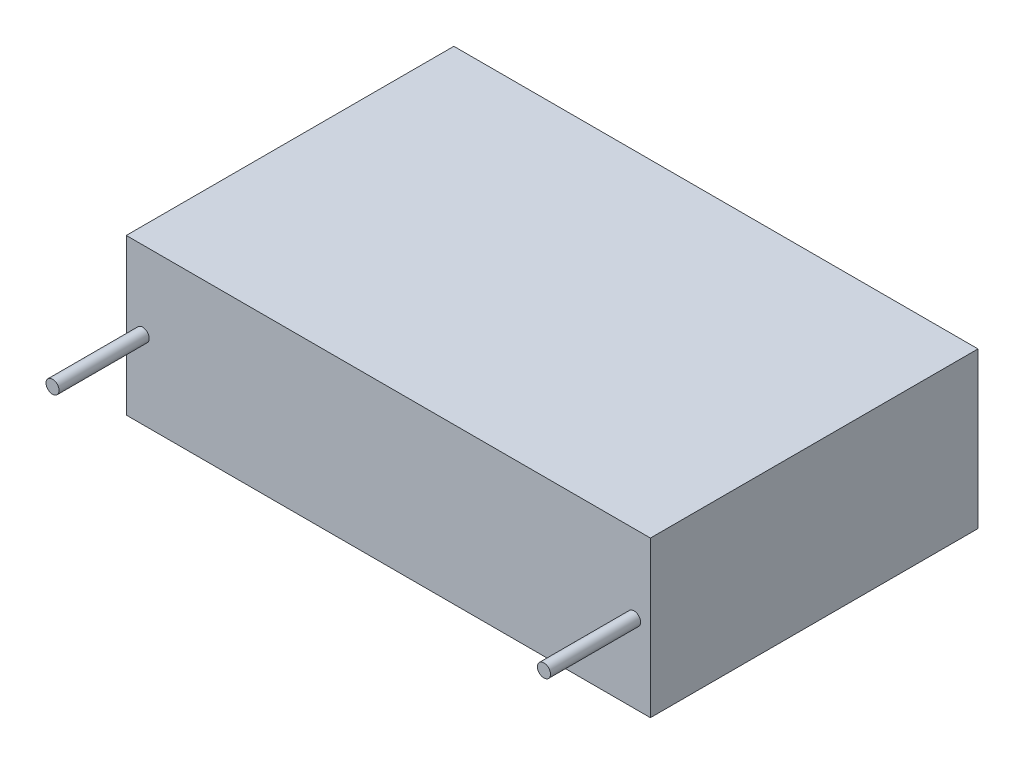
ISO-10303-21;
HEADER;
FILE_DESCRIPTION(('STEP AP214'),'2;1');
FILE_NAME('part.step','',(''),(''),'','','');
FILE_SCHEMA(('AUTOMOTIVE_DESIGN { 1 0 10303 214 1 1 1 1 }'));
ENDSEC;
DATA;
#1=APPLICATION_CONTEXT('core data for automotive mechanical design processes');
#2=APPLICATION_PROTOCOL_DEFINITION('international standard','automotive_design',2000,#1);
#3=PRODUCT_CONTEXT('',#1,'mechanical');
#4=PRODUCT('Part','Part','',(#3));
#5=PRODUCT_RELATED_PRODUCT_CATEGORY('part','',(#4));
#6=PRODUCT_DEFINITION_FORMATION('','',#4);
#7=PRODUCT_DEFINITION_CONTEXT('part definition',#1,'design');
#8=PRODUCT_DEFINITION('design','',#6,#7);
#9=PRODUCT_DEFINITION_SHAPE('','',#8);
#10=(LENGTH_UNIT() NAMED_UNIT(*) SI_UNIT(.MILLI.,.METRE.));
#11=(NAMED_UNIT(*) PLANE_ANGLE_UNIT() SI_UNIT($,.RADIAN.));
#12=(NAMED_UNIT(*) SI_UNIT($,.STERADIAN.) SOLID_ANGLE_UNIT());
#13=UNCERTAINTY_MEASURE_WITH_UNIT(LENGTH_MEASURE(1.E-05),#10,'distance_accuracy_value','');
#14=(GEOMETRIC_REPRESENTATION_CONTEXT(3) GLOBAL_UNCERTAINTY_ASSIGNED_CONTEXT((#13)) GLOBAL_UNIT_ASSIGNED_CONTEXT((#10,
#11,#12)) REPRESENTATION_CONTEXT('',''));
#15=CARTESIAN_POINT('',(0.,0.,0.));
#16=DIRECTION('',(0.,0.,1.));
#17=DIRECTION('',(1.,0.,0.));
#18=AXIS2_PLACEMENT_3D('',#15,#16,#17);
#19=CARTESIAN_POINT('',(0.,9.5,20.));
#20=DIRECTION('',(0.,0.,-1.));
#21=DIRECTION('',(-1.,0.,0.));
#22=AXIS2_PLACEMENT_3D('',#19,#20,#21);
#23=PLANE('',#22);
#24=CARTESIAN_POINT('',(1.,4.75,20.));
#25=DIRECTION('',(0.,0.,-1.));
#26=DIRECTION('',(-1.,0.,0.));
#27=AXIS2_PLACEMENT_3D('',#24,#25,#26);
#28=CIRCLE('',#27,0.4);
#29=CARTESIAN_POINT('',(0.600000000000001,4.75,20.));
#30=VERTEX_POINT('',#29);
#31=EDGE_CURVE('E40',#30,#30,#28,.F.);
#32=ORIENTED_EDGE('',*,*,#31,.F.);
#33=EDGE_LOOP('',(#32));
#34=FACE_BOUND('',#33,.T.);
#35=DIRECTION('',(0.,-1.,0.));
#36=VECTOR('',#35,1.);
#37=CARTESIAN_POINT('',(0.,0.,20.));
#38=LINE('',#37,#36);
#39=CARTESIAN_POINT('',(0.,9.5,20.));
#40=VERTEX_POINT('',#39);
#41=CARTESIAN_POINT('',(0.,0.,20.));
#42=VERTEX_POINT('',#41);
#43=EDGE_CURVE('E84',#40,#42,#38,.T.);
#44=ORIENTED_EDGE('',*,*,#43,.T.);
#45=DIRECTION('',(1.,0.,0.));
#46=VECTOR('',#45,1.);
#47=CARTESIAN_POINT('',(0.,0.,20.));
#48=LINE('',#47,#46);
#49=CARTESIAN_POINT('',(32.,0.,20.));
#50=VERTEX_POINT('',#49);
#51=EDGE_CURVE('E79',#42,#50,#48,.T.);
#52=ORIENTED_EDGE('',*,*,#51,.T.);
#53=DIRECTION('',(0.,1.,0.));
#54=VECTOR('',#53,1.);
#55=CARTESIAN_POINT('',(32.,0.,20.));
#56=LINE('',#55,#54);
#57=CARTESIAN_POINT('',(32.,9.5,20.));
#58=VERTEX_POINT('',#57);
#59=EDGE_CURVE('E82',#50,#58,#56,.T.);
#60=ORIENTED_EDGE('',*,*,#59,.T.);
#61=DIRECTION('',(-1.,0.,0.));
#62=VECTOR('',#61,1.);
#63=CARTESIAN_POINT('',(0.,9.5,20.));
#64=LINE('',#63,#62);
#65=EDGE_CURVE('E48',#58,#40,#64,.T.);
#66=ORIENTED_EDGE('',*,*,#65,.T.);
#67=EDGE_LOOP('',(#44,#52,#60,#66));
#68=FACE_BOUND('',#67,.T.);
#69=CARTESIAN_POINT('',(31.,4.75,20.));
#70=DIRECTION('',(0.,0.,-1.));
#71=DIRECTION('',(-1.,0.,0.));
#72=AXIS2_PLACEMENT_3D('',#69,#70,#71);
#73=CIRCLE('',#72,0.400000000000005);
#74=CARTESIAN_POINT('',(30.6,4.75,20.));
#75=VERTEX_POINT('',#74);
#76=EDGE_CURVE('E11',#75,#75,#73,.F.);
#77=ORIENTED_EDGE('',*,*,#76,.F.);
#78=EDGE_LOOP('',(#77));
#79=FACE_BOUND('',#78,.T.);
#80=ADVANCED_FACE('F31',(#34,#68,#79),#23,.F.);
#81=CARTESIAN_POINT('',(0.,0.,20.));
#82=DIRECTION('',(1.,0.,0.));
#83=DIRECTION('',(0.,0.,-1.));
#84=AXIS2_PLACEMENT_3D('',#81,#82,#83);
#85=PLANE('',#84);
#86=DIRECTION('',(0.,-1.,0.));
#87=VECTOR('',#86,1.);
#88=CARTESIAN_POINT('',(0.,0.,0.));
#89=LINE('',#88,#87);
#90=CARTESIAN_POINT('',(0.,9.5,0.));
#91=VERTEX_POINT('',#90);
#92=CARTESIAN_POINT('',(0.,0.,0.));
#93=VERTEX_POINT('',#92);
#94=EDGE_CURVE('E99',#91,#93,#89,.T.);
#95=ORIENTED_EDGE('',*,*,#94,.T.);
#96=DIRECTION('',(0.,0.,-1.));
#97=VECTOR('',#96,1.);
#98=CARTESIAN_POINT('',(0.,0.,20.));
#99=LINE('',#98,#97);
#100=EDGE_CURVE('E90',#42,#93,#99,.T.);
#101=ORIENTED_EDGE('',*,*,#100,.F.);
#102=ORIENTED_EDGE('',*,*,#43,.F.);
#103=DIRECTION('',(0.,0.,-1.));
#104=VECTOR('',#103,1.);
#105=CARTESIAN_POINT('',(0.,9.5,20.));
#106=LINE('',#105,#104);
#107=EDGE_CURVE('E95',#40,#91,#106,.T.);
#108=ORIENTED_EDGE('',*,*,#107,.T.);
#109=EDGE_LOOP('',(#95,#101,#102,#108));
#110=FACE_BOUND('',#109,.T.);
#111=ADVANCED_FACE('F33',(#110),#85,.F.);
#112=CARTESIAN_POINT('',(0.,0.,20.));
#113=DIRECTION('',(0.,1.,0.));
#114=DIRECTION('',(0.,0.,1.));
#115=AXIS2_PLACEMENT_3D('',#112,#113,#114);
#116=PLANE('',#115);
#117=DIRECTION('',(1.,0.,0.));
#118=VECTOR('',#117,1.);
#119=CARTESIAN_POINT('',(0.,0.,0.));
#120=LINE('',#119,#118);
#121=CARTESIAN_POINT('',(32.,0.,0.));
#122=VERTEX_POINT('',#121);
#123=EDGE_CURVE('E89',#93,#122,#120,.T.);
#124=ORIENTED_EDGE('',*,*,#123,.T.);
#125=DIRECTION('',(0.,0.,-1.));
#126=VECTOR('',#125,1.);
#127=CARTESIAN_POINT('',(32.,0.,20.));
#128=LINE('',#127,#126);
#129=EDGE_CURVE('E87',#50,#122,#128,.T.);
#130=ORIENTED_EDGE('',*,*,#129,.F.);
#131=ORIENTED_EDGE('',*,*,#51,.F.);
#132=ORIENTED_EDGE('',*,*,#100,.T.);
#133=EDGE_LOOP('',(#124,#130,#131,#132));
#134=FACE_BOUND('',#133,.T.);
#135=ADVANCED_FACE('F88',(#134),#116,.F.);
#136=CARTESIAN_POINT('',(32.,0.,20.));
#137=DIRECTION('',(-1.,0.,0.));
#138=DIRECTION('',(0.,0.,1.));
#139=AXIS2_PLACEMENT_3D('',#136,#137,#138);
#140=PLANE('',#139);
#141=DIRECTION('',(0.,1.,0.));
#142=VECTOR('',#141,1.);
#143=CARTESIAN_POINT('',(32.,0.,0.));
#144=LINE('',#143,#142);
#145=CARTESIAN_POINT('',(32.,9.5,0.));
#146=VERTEX_POINT('',#145);
#147=EDGE_CURVE('E65',#122,#146,#144,.T.);
#148=ORIENTED_EDGE('',*,*,#147,.T.);
#149=DIRECTION('',(0.,0.,-1.));
#150=VECTOR('',#149,1.);
#151=CARTESIAN_POINT('',(32.,9.5,20.));
#152=LINE('',#151,#150);
#153=EDGE_CURVE('E91',#58,#146,#152,.T.);
#154=ORIENTED_EDGE('',*,*,#153,.F.);
#155=ORIENTED_EDGE('',*,*,#59,.F.);
#156=ORIENTED_EDGE('',*,*,#129,.T.);
#157=EDGE_LOOP('',(#148,#154,#155,#156));
#158=FACE_BOUND('',#157,.T.);
#159=ADVANCED_FACE('F93',(#158),#140,.F.);
#160=CARTESIAN_POINT('',(0.,9.5,20.));
#161=DIRECTION('',(0.,-1.,0.));
#162=DIRECTION('',(0.,0.,-1.));
#163=AXIS2_PLACEMENT_3D('',#160,#161,#162);
#164=PLANE('',#163);
#165=DIRECTION('',(-1.,0.,0.));
#166=VECTOR('',#165,1.);
#167=CARTESIAN_POINT('',(0.,9.5,0.));
#168=LINE('',#167,#166);
#169=EDGE_CURVE('E71',#146,#91,#168,.T.);
#170=ORIENTED_EDGE('',*,*,#169,.T.);
#171=ORIENTED_EDGE('',*,*,#107,.F.);
#172=ORIENTED_EDGE('',*,*,#65,.F.);
#173=ORIENTED_EDGE('',*,*,#153,.T.);
#174=EDGE_LOOP('',(#170,#171,#172,#173));
#175=FACE_BOUND('',#174,.T.);
#176=ADVANCED_FACE('F125',(#175),#164,.F.);
#177=CARTESIAN_POINT('',(0.,9.5,0.));
#178=DIRECTION('',(0.,0.,-1.));
#179=DIRECTION('',(-1.,0.,0.));
#180=AXIS2_PLACEMENT_3D('',#177,#178,#179);
#181=PLANE('',#180);
#182=ORIENTED_EDGE('',*,*,#94,.F.);
#183=ORIENTED_EDGE('',*,*,#169,.F.);
#184=ORIENTED_EDGE('',*,*,#147,.F.);
#185=ORIENTED_EDGE('',*,*,#123,.F.);
#186=EDGE_LOOP('',(#182,#183,#184,#185));
#187=FACE_BOUND('',#186,.T.);
#188=ADVANCED_FACE('F122',(#187),#181,.T.);
#189=CARTESIAN_POINT('',(1.,4.75,25.5));
#190=DIRECTION('',(0.,0.,-1.));
#191=DIRECTION('',(-1.,0.,0.));
#192=AXIS2_PLACEMENT_3D('',#189,#190,#191);
#193=CYLINDRICAL_SURFACE('',#192,0.4);
#194=CARTESIAN_POINT('',(1.,4.75,25.5));
#195=DIRECTION('',(0.,0.,1.));
#196=DIRECTION('',(1.,0.,0.));
#197=AXIS2_PLACEMENT_3D('',#194,#195,#196);
#198=CIRCLE('',#197,0.4);
#199=CARTESIAN_POINT('',(1.4,4.75,25.5));
#200=VERTEX_POINT('',#199);
#201=EDGE_CURVE('E102',#200,#200,#198,.T.);
#202=ORIENTED_EDGE('',*,*,#201,.F.);
#203=EDGE_LOOP('',(#202));
#204=FACE_BOUND('',#203,.T.);
#205=ORIENTED_EDGE('',*,*,#31,.T.);
#206=EDGE_LOOP('',(#205));
#207=FACE_BOUND('',#206,.T.);
#208=ADVANCED_FACE('F111',(#204,#207),#193,.T.);
#209=CARTESIAN_POINT('',(1.,4.75,25.5));
#210=DIRECTION('',(0.,0.,1.));
#211=DIRECTION('',(1.,0.,0.));
#212=AXIS2_PLACEMENT_3D('',#209,#210,#211);
#213=PLANE('',#212);
#214=ORIENTED_EDGE('',*,*,#201,.T.);
#215=EDGE_LOOP('',(#214));
#216=FACE_BOUND('',#215,.T.);
#217=ADVANCED_FACE('F153',(#216),#213,.T.);
#218=CARTESIAN_POINT('',(31.,4.75,25.5));
#219=DIRECTION('',(0.,0.,-1.));
#220=DIRECTION('',(-1.,0.,0.));
#221=AXIS2_PLACEMENT_3D('',#218,#219,#220);
#222=CYLINDRICAL_SURFACE('',#221,0.400000000000005);
#223=CARTESIAN_POINT('',(31.,4.75,25.5));
#224=DIRECTION('',(0.,0.,1.));
#225=DIRECTION('',(1.,0.,0.));
#226=AXIS2_PLACEMENT_3D('',#223,#224,#225);
#227=CIRCLE('',#226,0.400000000000005);
#228=CARTESIAN_POINT('',(31.4,4.75,25.5));
#229=VERTEX_POINT('',#228);
#230=EDGE_CURVE('E204',#229,#229,#227,.T.);
#231=ORIENTED_EDGE('',*,*,#230,.F.);
#232=EDGE_LOOP('',(#231));
#233=FACE_BOUND('',#232,.T.);
#234=ORIENTED_EDGE('',*,*,#76,.T.);
#235=EDGE_LOOP('',(#234));
#236=FACE_BOUND('',#235,.T.);
#237=ADVANCED_FACE('F160',(#233,#236),#222,.T.);
#238=CARTESIAN_POINT('',(31.,4.75,25.5));
#239=DIRECTION('',(0.,0.,1.));
#240=DIRECTION('',(1.,0.,0.));
#241=AXIS2_PLACEMENT_3D('',#238,#239,#240);
#242=PLANE('',#241);
#243=ORIENTED_EDGE('',*,*,#230,.T.);
#244=EDGE_LOOP('',(#243));
#245=FACE_BOUND('',#244,.T.);
#246=ADVANCED_FACE('F167',(#245),#242,.T.);
#247=CLOSED_SHELL('',(#80,#111,#135,#159,#176,#188,#208,#217,#237,#246));
#248=MANIFOLD_SOLID_BREP('B2',#247);
#249=ADVANCED_BREP_SHAPE_REPRESENTATION('',(#18,#248),#14);
#250=SHAPE_DEFINITION_REPRESENTATION(#9,#249);
ENDSEC;
END-ISO-10303-21;
